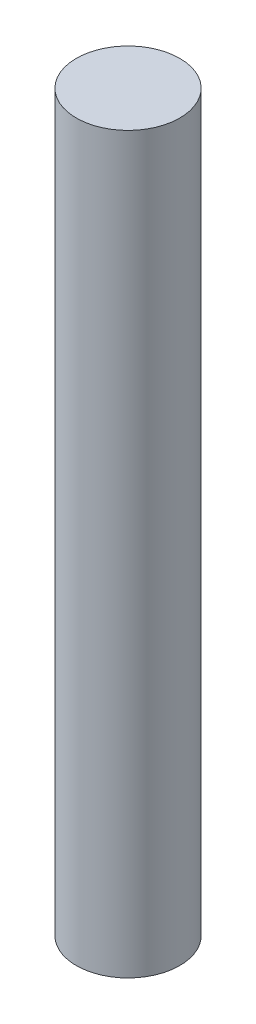
ISO-10303-21;
HEADER;
FILE_DESCRIPTION(('STEP AP214'),'2;1');
FILE_NAME('part.step','',(''),(''),'','','');
FILE_SCHEMA(('AUTOMOTIVE_DESIGN { 1 0 10303 214 1 1 1 1 }'));
ENDSEC;
DATA;
#1=APPLICATION_CONTEXT('core data for automotive mechanical design processes');
#2=APPLICATION_PROTOCOL_DEFINITION('international standard','automotive_design',2000,#1);
#3=PRODUCT_CONTEXT('',#1,'mechanical');
#4=PRODUCT('Part','Part','',(#3));
#5=PRODUCT_RELATED_PRODUCT_CATEGORY('part','',(#4));
#6=PRODUCT_DEFINITION_FORMATION('','',#4);
#7=PRODUCT_DEFINITION_CONTEXT('part definition',#1,'design');
#8=PRODUCT_DEFINITION('design','',#6,#7);
#9=PRODUCT_DEFINITION_SHAPE('','',#8);
#10=(LENGTH_UNIT() NAMED_UNIT(*) SI_UNIT(.MILLI.,.METRE.));
#11=(NAMED_UNIT(*) PLANE_ANGLE_UNIT() SI_UNIT($,.RADIAN.));
#12=(NAMED_UNIT(*) SI_UNIT($,.STERADIAN.) SOLID_ANGLE_UNIT());
#13=UNCERTAINTY_MEASURE_WITH_UNIT(LENGTH_MEASURE(1.E-05),#10,'distance_accuracy_value','');
#14=(GEOMETRIC_REPRESENTATION_CONTEXT(3) GLOBAL_UNCERTAINTY_ASSIGNED_CONTEXT((#13)) GLOBAL_UNIT_ASSIGNED_CONTEXT((#10,
#11,#12)) REPRESENTATION_CONTEXT('',''));
#15=CARTESIAN_POINT('',(0.,0.,0.));
#16=DIRECTION('',(0.,0.,1.));
#17=DIRECTION('',(1.,0.,0.));
#18=AXIS2_PLACEMENT_3D('',#15,#16,#17);
#19=CARTESIAN_POINT('',(-24.4127398922432,-8.75465516014281,-3.43304154734661));
#20=DIRECTION('',(0.,-1.,0.));
#21=DIRECTION('',(0.,0.,-1.));
#22=AXIS2_PLACEMENT_3D('',#19,#20,#21);
#23=PLANE('',#22);
#24=CARTESIAN_POINT('',(-22.9699187043962,-8.75465516014281,-13.6931033275923));
#25=DIRECTION('',(0.,-1.,0.));
#26=DIRECTION('',(0.,0.,-1.));
#27=AXIS2_PLACEMENT_3D('',#24,#25,#26);
#28=CIRCLE('',#27,1.35254999999999);
#29=CARTESIAN_POINT('',(-22.9699187043962,-8.75465516014281,-15.0456533275923));
#30=VERTEX_POINT('',#29);
#31=EDGE_CURVE('E68',#30,#30,#28,.T.);
#32=ORIENTED_EDGE('',*,*,#31,.F.);
#33=EDGE_LOOP('',(#32));
#34=FACE_BOUND('',#33,.T.);
#35=CARTESIAN_POINT('',(-22.9699187043962,-8.75465516014282,-13.6931033275923));
#36=DIRECTION('',(0.,-1.,0.));
#37=DIRECTION('',(0.,0.,-1.));
#38=AXIS2_PLACEMENT_3D('',#35,#36,#37);
#39=CIRCLE('',#38,4.76250000000001);
#40=CARTESIAN_POINT('',(-22.9699187043962,-8.75465516014283,-18.4556033275923));
#41=VERTEX_POINT('',#40);
#42=EDGE_CURVE('E13',#41,#41,#39,.T.);
#43=ORIENTED_EDGE('',*,*,#42,.T.);
#44=EDGE_LOOP('',(#43));
#45=FACE_BOUND('',#44,.T.);
#46=ADVANCED_FACE('F49',(#34,#45),#23,.T.);
#47=CARTESIAN_POINT('',(-22.9699187043962,-8.75465516014282,-13.6931033275923));
#48=DIRECTION('',(0.,-1.,0.));
#49=DIRECTION('',(0.,0.,-1.));
#50=AXIS2_PLACEMENT_3D('',#47,#48,#49);
#51=CYLINDRICAL_SURFACE('',#50,4.7625000000003);
#52=CARTESIAN_POINT('',(-22.9699187043962,58.8347178017715,-13.6931033275924));
#53=DIRECTION('',(0.,-1.,0.));
#54=DIRECTION('',(0.,0.,-1.));
#55=AXIS2_PLACEMENT_3D('',#52,#53,#54);
#56=CIRCLE('',#55,4.76250000000059);
#57=CARTESIAN_POINT('',(-22.9699187043962,58.8347178017715,-18.455603327593));
#58=VERTEX_POINT('',#57);
#59=EDGE_CURVE('E55',#58,#58,#56,.T.);
#60=ORIENTED_EDGE('',*,*,#59,.T.);
#61=EDGE_LOOP('',(#60));
#62=FACE_BOUND('',#61,.T.);
#63=ORIENTED_EDGE('',*,*,#42,.F.);
#64=EDGE_LOOP('',(#63));
#65=FACE_BOUND('',#64,.T.);
#66=ADVANCED_FACE('F78',(#62,#65),#51,.T.);
#67=CARTESIAN_POINT('',(-24.4127398922433,58.8347178017716,-3.4330415473461));
#68=DIRECTION('',(0.,-1.,0.));
#69=DIRECTION('',(0.,0.,-1.));
#70=AXIS2_PLACEMENT_3D('',#67,#68,#69);
#71=PLANE('',#70);
#72=ORIENTED_EDGE('',*,*,#59,.F.);
#73=EDGE_LOOP('',(#72));
#74=FACE_BOUND('',#73,.T.);
#75=ADVANCED_FACE('F62',(#74),#71,.F.);
#76=CARTESIAN_POINT('',(-22.9699187043962,18.2645948398572,-13.6931033275923));
#77=DIRECTION('',(0.,-1.,0.));
#78=DIRECTION('',(0.,0.,-1.));
#79=AXIS2_PLACEMENT_3D('',#76,#77,#78);
#80=CONICAL_SURFACE('',#79,1.35254999999999,1.02974425867665);
#81=CARTESIAN_POINT('',(-22.9699187043962,19.0772888701229,-13.6931033275923));
#82=VERTEX_POINT('',#81);
#83=VERTEX_LOOP('',#82);
#84=FACE_BOUND('',#83,.T.);
#85=CARTESIAN_POINT('',(-22.9699187043962,18.2645948398572,-13.6931033275923));
#86=DIRECTION('',(0.,-1.,0.));
#87=DIRECTION('',(0.,0.,-1.));
#88=AXIS2_PLACEMENT_3D('',#85,#86,#87);
#89=CIRCLE('',#88,1.35254999999999);
#90=CARTESIAN_POINT('',(-22.9699187043962,18.2645948398572,-15.0456533275923));
#91=VERTEX_POINT('',#90);
#92=EDGE_CURVE('E66',#91,#91,#89,.T.);
#93=ORIENTED_EDGE('',*,*,#92,.T.);
#94=EDGE_LOOP('',(#93));
#95=FACE_BOUND('',#94,.T.);
#96=ADVANCED_FACE('F58',(#84,#95),#80,.F.);
#97=CARTESIAN_POINT('',(-22.9699187043962,-8.75465516014281,-13.6931033275923));
#98=DIRECTION('',(0.,-1.,0.));
#99=DIRECTION('',(0.,0.,-1.));
#100=AXIS2_PLACEMENT_3D('',#97,#98,#99);
#101=CYLINDRICAL_SURFACE('',#100,1.35254999999999);
#102=ORIENTED_EDGE('',*,*,#92,.F.);
#103=EDGE_LOOP('',(#102));
#104=FACE_BOUND('',#103,.T.);
#105=ORIENTED_EDGE('',*,*,#31,.T.);
#106=EDGE_LOOP('',(#105));
#107=FACE_BOUND('',#106,.T.);
#108=ADVANCED_FACE('F61',(#104,#107),#101,.F.);
#109=CLOSED_SHELL('',(#46,#66,#75,#96,#108));
#110=MANIFOLD_SOLID_BREP('B2',#109);
#111=ADVANCED_BREP_SHAPE_REPRESENTATION('',(#18,#110),#14);
#112=SHAPE_DEFINITION_REPRESENTATION(#9,#111);
ENDSEC;
END-ISO-10303-21;
